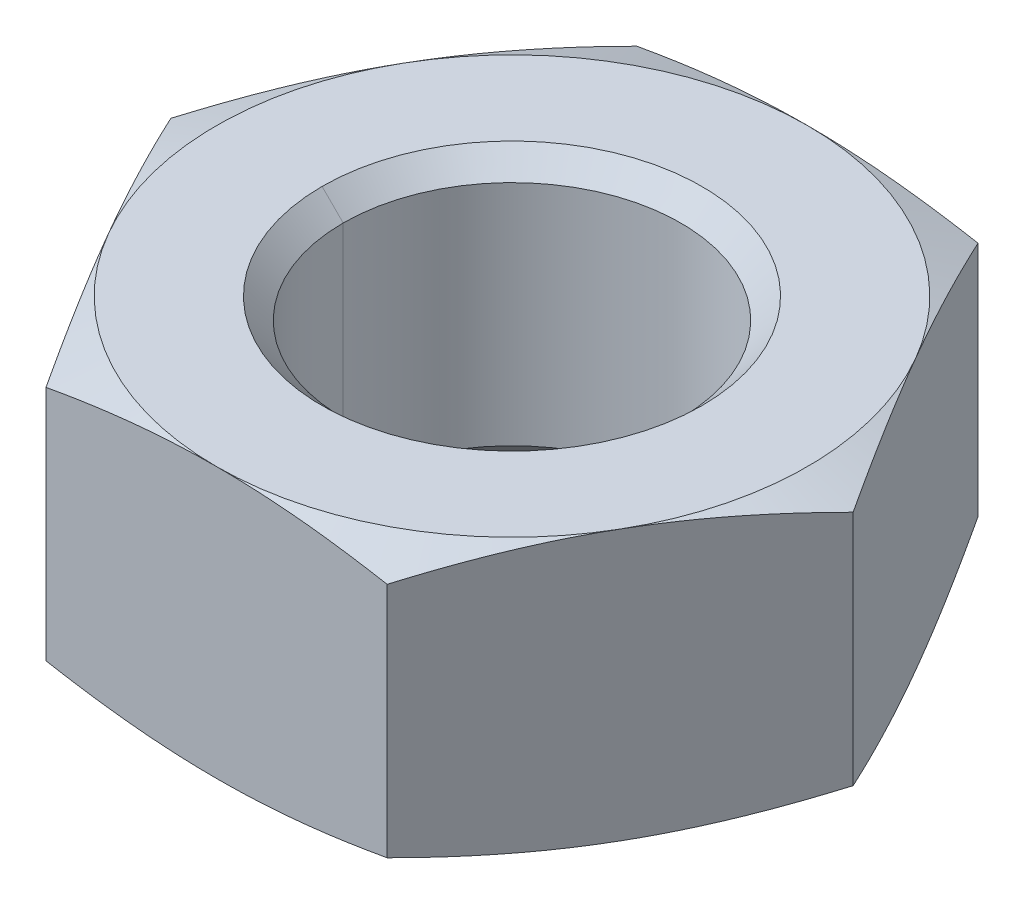
ISO-10303-21;
HEADER;
FILE_DESCRIPTION(('STEP AP214'),'2;1');
FILE_NAME('part.step','',(''),(''),'','','');
FILE_SCHEMA(('AUTOMOTIVE_DESIGN { 1 0 10303 214 1 1 1 1 }'));
ENDSEC;
DATA;
#1=APPLICATION_CONTEXT('core data for automotive mechanical design processes');
#2=APPLICATION_PROTOCOL_DEFINITION('international standard','automotive_design',2000,#1);
#3=PRODUCT_CONTEXT('',#1,'mechanical');
#4=PRODUCT('Part','Part','',(#3));
#5=PRODUCT_RELATED_PRODUCT_CATEGORY('part','',(#4));
#6=PRODUCT_DEFINITION_FORMATION('','',#4);
#7=PRODUCT_DEFINITION_CONTEXT('part definition',#1,'design');
#8=PRODUCT_DEFINITION('design','',#6,#7);
#9=PRODUCT_DEFINITION_SHAPE('','',#8);
#10=(LENGTH_UNIT() NAMED_UNIT(*) SI_UNIT(.MILLI.,.METRE.));
#11=(NAMED_UNIT(*) PLANE_ANGLE_UNIT() SI_UNIT($,.RADIAN.));
#12=(NAMED_UNIT(*) SI_UNIT($,.STERADIAN.) SOLID_ANGLE_UNIT());
#13=UNCERTAINTY_MEASURE_WITH_UNIT(LENGTH_MEASURE(1.E-05),#10,'distance_accuracy_value','');
#14=(GEOMETRIC_REPRESENTATION_CONTEXT(3) GLOBAL_UNCERTAINTY_ASSIGNED_CONTEXT((#13)) GLOBAL_UNIT_ASSIGNED_CONTEXT((#10,
#11,#12)) REPRESENTATION_CONTEXT('',''));
#15=CARTESIAN_POINT('',(0.,0.,0.));
#16=DIRECTION('',(0.,0.,1.));
#17=DIRECTION('',(1.,0.,0.));
#18=AXIS2_PLACEMENT_3D('',#15,#16,#17);
#19=CARTESIAN_POINT('',(0.,0.1250000000798,0.));
#20=DIRECTION('',(0.,-1.,0.));
#21=DIRECTION('',(0.,0.,-1.));
#22=AXIS2_PLACEMENT_3D('',#19,#20,#21);
#23=CONICAL_SURFACE('',#22,2.12499999992,0.7853981633973);
#24=DIRECTION('',(-0.707106781186548,0.707106781186548,1.17576592888708E-09));
#25=VECTOR('',#24,1.);
#26=CARTESIAN_POINT('',(2.249999999907,9.279510493343E-11,-1.247085195041E-09));
#27=LINE('',#26,#25);
#28=CARTESIAN_POINT('',(2.25,0.,0.));
#29=VERTEX_POINT('',#28);
#30=CARTESIAN_POINT('',(2.,0.25,0.));
#31=VERTEX_POINT('',#30);
#32=EDGE_CURVE('E11',#29,#31,#27,.T.);
#33=ORIENTED_EDGE('',*,*,#32,.T.);
#34=CARTESIAN_POINT('',(0.,0.25,0.));
#35=DIRECTION('',(0.,1.,0.));
#36=DIRECTION('',(1.,0.,0.));
#37=AXIS2_PLACEMENT_3D('',#34,#35,#36);
#38=CIRCLE('',#37,2.);
#39=CARTESIAN_POINT('',(-2.,0.25,0.));
#40=VERTEX_POINT('',#39);
#41=EDGE_CURVE('E389',#31,#40,#38,.T.);
#42=ORIENTED_EDGE('',*,*,#41,.T.);
#43=DIRECTION('',(0.707106781186548,0.707106781186548,-1.17576307555008E-09));
#44=VECTOR('',#43,1.);
#45=CARTESIAN_POINT('',(-2.249999999907,9.279510493343E-11,1.247084647792E-09));
#46=LINE('',#45,#44);
#47=CARTESIAN_POINT('',(-2.25,0.,0.));
#48=VERTEX_POINT('',#47);
#49=EDGE_CURVE('E26',#48,#40,#46,.T.);
#50=ORIENTED_EDGE('',*,*,#49,.F.);
#51=CARTESIAN_POINT('',(0.,0.,0.));
#52=DIRECTION('',(0.,1.,0.));
#53=DIRECTION('',(1.,0.,0.));
#54=AXIS2_PLACEMENT_3D('',#51,#52,#53);
#55=CIRCLE('',#54,2.25);
#56=EDGE_CURVE('E371',#29,#48,#55,.T.);
#57=ORIENTED_EDGE('',*,*,#56,.F.);
#58=EDGE_LOOP('',(#33,#42,#50,#57));
#59=FACE_BOUND('',#58,.T.);
#60=ADVANCED_FACE('F16',(#59),#23,.F.);
#61=CARTESIAN_POINT('',(0.,0.1250000000798,0.));
#62=DIRECTION('',(0.,-1.,0.));
#63=DIRECTION('',(0.,0.,-1.));
#64=AXIS2_PLACEMENT_3D('',#61,#62,#63);
#65=CONICAL_SURFACE('',#64,2.12499999992,0.7853981633973);
#66=ORIENTED_EDGE('',*,*,#49,.T.);
#67=CARTESIAN_POINT('',(0.,0.25,0.));
#68=DIRECTION('',(0.,1.,0.));
#69=DIRECTION('',(-1.,0.,0.));
#70=AXIS2_PLACEMENT_3D('',#67,#68,#69);
#71=CIRCLE('',#70,2.);
#72=EDGE_CURVE('E357',#40,#31,#71,.T.);
#73=ORIENTED_EDGE('',*,*,#72,.T.);
#74=ORIENTED_EDGE('',*,*,#32,.F.);
#75=CARTESIAN_POINT('',(0.,0.,0.));
#76=DIRECTION('',(0.,1.,0.));
#77=DIRECTION('',(-1.,0.,0.));
#78=AXIS2_PLACEMENT_3D('',#75,#76,#77);
#79=CIRCLE('',#78,2.25);
#80=EDGE_CURVE('E173',#48,#29,#79,.T.);
#81=ORIENTED_EDGE('',*,*,#80,.F.);
#82=EDGE_LOOP('',(#66,#73,#74,#81));
#83=FACE_BOUND('',#82,.T.);
#84=ADVANCED_FACE('F688',(#83),#65,.F.);
#85=CARTESIAN_POINT('',(0.,3.2,0.));
#86=DIRECTION('',(0.,1.,0.));
#87=DIRECTION('',(1.,0.,0.));
#88=AXIS2_PLACEMENT_3D('',#85,#86,#87);
#89=CYLINDRICAL_SURFACE('',#88,2.);
#90=DIRECTION('',(0.,-1.,0.));
#91=VECTOR('',#90,1.);
#92=CARTESIAN_POINT('',(1.999999999938,2.949999999938,-8.313895128431E-10));
#93=LINE('',#92,#91);
#94=CARTESIAN_POINT('',(2.,2.95,0.));
#95=VERTEX_POINT('',#94);
#96=EDGE_CURVE('E360',#95,#31,#93,.T.);
#97=ORIENTED_EDGE('',*,*,#96,.T.);
#98=ORIENTED_EDGE('',*,*,#72,.F.);
#99=DIRECTION('',(0.,-1.,0.));
#100=VECTOR('',#99,1.);
#101=CARTESIAN_POINT('',(-1.999999999938,2.949999999938,8.313897474171E-10));
#102=LINE('',#101,#100);
#103=CARTESIAN_POINT('',(-2.,2.95,0.));
#104=VERTEX_POINT('',#103);
#105=EDGE_CURVE('E352',#104,#40,#102,.T.);
#106=ORIENTED_EDGE('',*,*,#105,.F.);
#107=CARTESIAN_POINT('',(0.,2.95,0.));
#108=DIRECTION('',(0.,-1.,0.));
#109=DIRECTION('',(1.,0.,0.));
#110=AXIS2_PLACEMENT_3D('',#107,#108,#109);
#111=CIRCLE('',#110,2.);
#112=EDGE_CURVE('E372',#95,#104,#111,.T.);
#113=ORIENTED_EDGE('',*,*,#112,.F.);
#114=EDGE_LOOP('',(#97,#98,#106,#113));
#115=FACE_BOUND('',#114,.T.);
#116=ADVANCED_FACE('F693',(#115),#89,.F.);
#117=CARTESIAN_POINT('',(0.,3.2,0.));
#118=DIRECTION('',(0.,1.,0.));
#119=DIRECTION('',(1.,0.,0.));
#120=AXIS2_PLACEMENT_3D('',#117,#118,#119);
#121=CYLINDRICAL_SURFACE('',#120,2.);
#122=ORIENTED_EDGE('',*,*,#105,.T.);
#123=ORIENTED_EDGE('',*,*,#41,.F.);
#124=ORIENTED_EDGE('',*,*,#96,.F.);
#125=CARTESIAN_POINT('',(0.,2.95,0.));
#126=DIRECTION('',(0.,-1.,0.));
#127=DIRECTION('',(-1.,0.,0.));
#128=AXIS2_PLACEMENT_3D('',#125,#126,#127);
#129=CIRCLE('',#128,2.);
#130=EDGE_CURVE('E345',#104,#95,#129,.T.);
#131=ORIENTED_EDGE('',*,*,#130,.F.);
#132=EDGE_LOOP('',(#122,#123,#124,#131));
#133=FACE_BOUND('',#132,.T.);
#134=ADVANCED_FACE('F713',(#133),#121,.F.);
#135=CARTESIAN_POINT('',(0.,3.07499999992,0.));
#136=DIRECTION('',(0.,1.,0.));
#137=DIRECTION('',(0.,0.,-1.));
#138=AXIS2_PLACEMENT_3D('',#135,#136,#137);
#139=CONICAL_SURFACE('',#138,2.12499999992,0.7853981633973);
#140=DIRECTION('',(0.707106781186548,-0.707106781186548,-1.17576266670908E-09));
#141=VECTOR('',#140,1.);
#142=CARTESIAN_POINT('',(-2.249999999907,3.199999999907,1.247084624713E-09));
#143=LINE('',#142,#141);
#144=CARTESIAN_POINT('',(-2.25,3.2,0.));
#145=VERTEX_POINT('',#144);
#146=EDGE_CURVE('E353',#145,#104,#143,.T.);
#147=ORIENTED_EDGE('',*,*,#146,.T.);
#148=ORIENTED_EDGE('',*,*,#130,.T.);
#149=DIRECTION('',(-0.707106781186548,-0.707106781186548,1.17576334367408E-09));
#150=VECTOR('',#149,1.);
#151=CARTESIAN_POINT('',(2.249999999907,3.199999999907,-1.247084629483E-09));
#152=LINE('',#151,#150);
#153=CARTESIAN_POINT('',(2.25,3.2,0.));
#154=VERTEX_POINT('',#153);
#155=EDGE_CURVE('E376',#154,#95,#152,.T.);
#156=ORIENTED_EDGE('',*,*,#155,.F.);
#157=CARTESIAN_POINT('',(0.,3.2,0.));
#158=DIRECTION('',(0.,-1.,0.));
#159=DIRECTION('',(-1.,0.,0.));
#160=AXIS2_PLACEMENT_3D('',#157,#158,#159);
#161=CIRCLE('',#160,2.25);
#162=EDGE_CURVE('E242',#145,#154,#161,.T.);
#163=ORIENTED_EDGE('',*,*,#162,.F.);
#164=EDGE_LOOP('',(#147,#148,#156,#163));
#165=FACE_BOUND('',#164,.T.);
#166=ADVANCED_FACE('F708',(#165),#139,.F.);
#167=CARTESIAN_POINT('',(0.,3.07499999992,0.));
#168=DIRECTION('',(0.,1.,0.));
#169=DIRECTION('',(0.,0.,-1.));
#170=AXIS2_PLACEMENT_3D('',#167,#168,#169);
#171=CONICAL_SURFACE('',#170,2.12499999992,0.7853981633973);
#172=ORIENTED_EDGE('',*,*,#155,.T.);
#173=ORIENTED_EDGE('',*,*,#112,.T.);
#174=ORIENTED_EDGE('',*,*,#146,.F.);
#175=CARTESIAN_POINT('',(0.,3.2,0.));
#176=DIRECTION('',(0.,-1.,0.));
#177=DIRECTION('',(1.,0.,0.));
#178=AXIS2_PLACEMENT_3D('',#175,#176,#177);
#179=CIRCLE('',#178,2.25);
#180=EDGE_CURVE('E20',#154,#145,#179,.T.);
#181=ORIENTED_EDGE('',*,*,#180,.F.);
#182=EDGE_LOOP('',(#172,#173,#174,#181));
#183=FACE_BOUND('',#182,.T.);
#184=ADVANCED_FACE('F18',(#183),#171,.F.);
#185=CARTESIAN_POINT('',(2.020725942164,0.,-3.5));
#186=DIRECTION('',(0.,0.,-1.));
#187=DIRECTION('',(0.,-1.,0.));
#188=AXIS2_PLACEMENT_3D('',#185,#186,#187);
#189=PLANE('',#188);
#190=CARTESIAN_POINT('',(0.,3.2,-3.5));
#191=CARTESIAN_POINT('',(0.1339194928935,3.2,-3.5));
#192=CARTESIAN_POINT('',(0.4014780252801,3.194384619764,-3.5));
#193=CARTESIAN_POINT('',(0.8017778390431,3.169575725015,-3.5));
#194=CARTESIAN_POINT('',(1.201630119939,3.12936102724,-3.5));
#195=CARTESIAN_POINT('',(1.604047431304,3.074757420419,-3.5));
#196=CARTESIAN_POINT('',(1.880778102078,3.028396054888,-3.5));
#197=CARTESIAN_POINT('',(2.020725942164,3.002927630817,-3.5));
#198=(BOUNDED_CURVE() B_SPLINE_CURVE(3,(#190,#191,#192,#193,#194,#195,#196,#197),.UNSPECIFIED.,
.F.,.F.) B_SPLINE_CURVE_WITH_KNOTS((4,1,1,1,1,4),(0.,0.2,0.4,0.6,0.8,1.),
.UNSPECIFIED.) CURVE() GEOMETRIC_REPRESENTATION_ITEM() RATIONAL_B_SPLINE_CURVE((1.,1.,1.,1.,1.,
1.,1.,1.)) REPRESENTATION_ITEM(''));
#199=CARTESIAN_POINT('',(0.,3.2,-3.5));
#200=VERTEX_POINT('',#199);
#201=CARTESIAN_POINT('',(2.020725942164,3.002927630817,-3.5));
#202=VERTEX_POINT('',#201);
#203=EDGE_CURVE('E208',#200,#202,#198,.T.);
#204=ORIENTED_EDGE('',*,*,#203,.T.);
#205=DIRECTION('',(0.,1.,0.));
#206=VECTOR('',#205,1.);
#207=CARTESIAN_POINT('',(2.020725942164,0.1970723691825,-3.5));
#208=LINE('',#207,#206);
#209=CARTESIAN_POINT('',(2.020725942164,0.1970723691825,-3.5));
#210=VERTEX_POINT('',#209);
#211=EDGE_CURVE('E167',#210,#202,#208,.T.);
#212=ORIENTED_EDGE('',*,*,#211,.F.);
#213=CARTESIAN_POINT('',(0.,0.,-3.5));
#214=CARTESIAN_POINT('',(0.1339194928935,0.,-3.5));
#215=CARTESIAN_POINT('',(0.4014780252801,0.00561538023578,-3.5));
#216=CARTESIAN_POINT('',(0.8017778390431,0.03042427498523,-3.5));
#217=CARTESIAN_POINT('',(1.201630119939,0.0706389727602,-3.5));
#218=CARTESIAN_POINT('',(1.604047431304,0.1252425795814,-3.5));
#219=CARTESIAN_POINT('',(1.880778102078,0.171603945112,-3.5));
#220=CARTESIAN_POINT('',(2.020725942164,0.1970723691825,-3.5));
#221=(BOUNDED_CURVE() B_SPLINE_CURVE(3,(#213,#214,#215,#216,#217,#218,#219,#220),.UNSPECIFIED.,
.F.,.F.) B_SPLINE_CURVE_WITH_KNOTS((4,1,1,1,1,4),(0.,0.2,0.4,0.6,0.8,1.),
.UNSPECIFIED.) CURVE() GEOMETRIC_REPRESENTATION_ITEM() RATIONAL_B_SPLINE_CURVE((1.,1.,1.,1.,1.,
1.,1.,1.)) REPRESENTATION_ITEM(''));
#222=CARTESIAN_POINT('',(0.,0.,-3.5));
#223=VERTEX_POINT('',#222);
#224=EDGE_CURVE('E163',#223,#210,#221,.T.);
#225=ORIENTED_EDGE('',*,*,#224,.F.);
#226=CARTESIAN_POINT('',(-2.020725942164,0.1970723691825,-3.5));
#227=CARTESIAN_POINT('',(-1.880789645323,0.1716060458108,-3.5));
#228=CARTESIAN_POINT('',(-1.604066452559,0.125244479407,-3.5));
#229=CARTESIAN_POINT('',(-1.201512024155,0.07062397958714,-3.5));
#230=CARTESIAN_POINT('',(-0.8016732597447,0.0304163872762,-3.5));
#231=CARTESIAN_POINT('',(-0.4014197833047,0.005613602052182,-3.5));
#232=CARTESIAN_POINT('',(-0.1338981911009,0.,-3.5));
#233=CARTESIAN_POINT('',(0.,0.,-3.5));
#234=(BOUNDED_CURVE() B_SPLINE_CURVE(3,(#226,#227,#228,#229,#230,#231,#232,#233),.UNSPECIFIED.,
.F.,.F.) B_SPLINE_CURVE_WITH_KNOTS((4,1,1,1,1,4),(0.,0.2,0.4,0.6,0.8,1.),
.UNSPECIFIED.) CURVE() GEOMETRIC_REPRESENTATION_ITEM() RATIONAL_B_SPLINE_CURVE((1.,1.,1.,1.,1.,
1.,1.,1.)) REPRESENTATION_ITEM(''));
#235=CARTESIAN_POINT('',(-2.020725942164,0.1970723691825,-3.5));
#236=VERTEX_POINT('',#235);
#237=EDGE_CURVE('E152',#236,#223,#234,.T.);
#238=ORIENTED_EDGE('',*,*,#237,.F.);
#239=DIRECTION('',(0.,1.,0.));
#240=VECTOR('',#239,1.);
#241=CARTESIAN_POINT('',(-2.020725942164,0.1970723691825,-3.5));
#242=LINE('',#241,#240);
#243=CARTESIAN_POINT('',(-2.020725942164,3.002927630817,-3.5));
#244=VERTEX_POINT('',#243);
#245=EDGE_CURVE('E367',#236,#244,#242,.T.);
#246=ORIENTED_EDGE('',*,*,#245,.T.);
#247=CARTESIAN_POINT('',(-2.020725942164,3.002927630817,-3.5));
#248=CARTESIAN_POINT('',(-1.880789645323,3.028393954189,-3.5));
#249=CARTESIAN_POINT('',(-1.604066452559,3.074755520593,-3.5));
#250=CARTESIAN_POINT('',(-1.201512024155,3.129376020413,-3.5));
#251=CARTESIAN_POINT('',(-0.8016732597447,3.169583612724,-3.5));
#252=CARTESIAN_POINT('',(-0.4014197833047,3.194386397948,-3.5));
#253=CARTESIAN_POINT('',(-0.1338981911009,3.2,-3.5));
#254=CARTESIAN_POINT('',(0.,3.2,-3.5));
#255=(BOUNDED_CURVE() B_SPLINE_CURVE(3,(#247,#248,#249,#250,#251,#252,#253,#254),.UNSPECIFIED.,
.F.,.F.) B_SPLINE_CURVE_WITH_KNOTS((4,1,1,1,1,4),(0.,0.2,0.4,0.6,0.8,1.),
.UNSPECIFIED.) CURVE() GEOMETRIC_REPRESENTATION_ITEM() RATIONAL_B_SPLINE_CURVE((1.,1.,1.,1.,1.,
1.,1.,1.)) REPRESENTATION_ITEM(''));
#256=EDGE_CURVE('E273',#244,#200,#255,.T.);
#257=ORIENTED_EDGE('',*,*,#256,.T.);
#258=EDGE_LOOP('',(#204,#212,#225,#238,#246,#257));
#259=FACE_BOUND('',#258,.T.);
#260=ADVANCED_FACE('F165',(#259),#189,.T.);
#261=CARTESIAN_POINT('',(-2.020725942164,0.,-3.5));
#262=DIRECTION('',(-0.866025403784429,0.,-0.500000000000017));
#263=DIRECTION('',(-0.500000000000017,0.,0.866025403784429));
#264=AXIS2_PLACEMENT_3D('',#261,#262,#263);
#265=PLANE('',#264);
#266=CARTESIAN_POINT('',(-3.031088913246,3.2,-1.75));
#267=CARTESIAN_POINT('',(-2.964129166799,3.2,-1.865977682908));
#268=CARTESIAN_POINT('',(-2.830349900605,3.194384619764,-2.097690168954));
#269=CARTESIAN_POINT('',(-2.630199993724,3.169575725015,-2.444359976803));
#270=CARTESIAN_POINT('',(-2.430273853276,3.12936102724,-2.79064220982));
#271=CARTESIAN_POINT('',(-2.229065197593,3.074757420419,-3.139145824385));
#272=CARTESIAN_POINT('',(-2.090699862207,3.028396054888,-3.378801615281));
#273=CARTESIAN_POINT('',(-2.020725942164,3.002927630817,-3.5));
#274=(BOUNDED_CURVE() B_SPLINE_CURVE(3,(#266,#267,#268,#269,#270,#271,#272,#273),.UNSPECIFIED.,
.F.,.F.) B_SPLINE_CURVE_WITH_KNOTS((4,1,1,1,1,4),(0.,0.2,0.4,0.6,0.8,1.),
.UNSPECIFIED.) CURVE() GEOMETRIC_REPRESENTATION_ITEM() RATIONAL_B_SPLINE_CURVE((1.,1.,1.,1.,1.,
1.,1.,1.)) REPRESENTATION_ITEM(''));
#275=CARTESIAN_POINT('',(-3.031088913246,3.2,-1.75));
#276=VERTEX_POINT('',#275);
#277=EDGE_CURVE('E263',#276,#244,#274,.T.);
#278=ORIENTED_EDGE('',*,*,#277,.T.);
#279=ORIENTED_EDGE('',*,*,#245,.F.);
#280=CARTESIAN_POINT('',(-3.031088913246,0.,-1.75));
#281=CARTESIAN_POINT('',(-2.964129166799,0.,-1.865977682908));
#282=CARTESIAN_POINT('',(-2.830349900605,0.005615380235781,-2.097690168954));
#283=CARTESIAN_POINT('',(-2.630199993724,0.03042427498523,-2.444359976803));
#284=CARTESIAN_POINT('',(-2.430273853276,0.0706389727602,-2.79064220982));
#285=CARTESIAN_POINT('',(-2.229065197593,0.1252425795814,-3.139145824385));
#286=CARTESIAN_POINT('',(-2.090699862207,0.171603945112,-3.378801615281));
#287=CARTESIAN_POINT('',(-2.020725942164,0.1970723691825,-3.5));
#288=(BOUNDED_CURVE() B_SPLINE_CURVE(3,(#280,#281,#282,#283,#284,#285,#286,#287),.UNSPECIFIED.,
.F.,.F.) B_SPLINE_CURVE_WITH_KNOTS((4,1,1,1,1,4),(0.,0.2,0.4,0.6,0.8,1.),
.UNSPECIFIED.) CURVE() GEOMETRIC_REPRESENTATION_ITEM() RATIONAL_B_SPLINE_CURVE((1.,1.,1.,1.,1.,
1.,1.,1.)) REPRESENTATION_ITEM(''));
#289=CARTESIAN_POINT('',(-3.031088913246,0.,-1.75));
#290=VERTEX_POINT('',#289);
#291=EDGE_CURVE('E157',#290,#236,#288,.T.);
#292=ORIENTED_EDGE('',*,*,#291,.F.);
#293=CARTESIAN_POINT('',(-4.041451884327,0.1970723691825,0.));
#294=CARTESIAN_POINT('',(-3.971483735907,0.1716060458108,-0.1211883879753));
#295=CARTESIAN_POINT('',(-3.833122139525,0.125244479407,-0.3608377027251));
#296=CARTESIAN_POINT('',(-3.631844925323,0.07062397958714,-0.7094600641289));
#297=CARTESIAN_POINT('',(-3.431925543118,0.0304163872762,-1.055730591526));
#298=CARTESIAN_POINT('',(-3.231798804898,0.005613602052183,-1.402360270076));
#299=CARTESIAN_POINT('',(-3.098038008796,0.,-1.634040764986));
#300=CARTESIAN_POINT('',(-3.031088913246,0.,-1.75));
#301=(BOUNDED_CURVE() B_SPLINE_CURVE(3,(#293,#294,#295,#296,#297,#298,#299,#300),.UNSPECIFIED.,
.F.,.F.) B_SPLINE_CURVE_WITH_KNOTS((4,1,1,1,1,4),(0.,0.2,0.4,0.6,0.8,1.),
.UNSPECIFIED.) CURVE() GEOMETRIC_REPRESENTATION_ITEM() RATIONAL_B_SPLINE_CURVE((1.,1.,1.,1.,1.,
1.,1.,1.)) REPRESENTATION_ITEM(''));
#302=CARTESIAN_POINT('',(-4.041451884327,0.1970723691825,0.));
#303=VERTEX_POINT('',#302);
#304=EDGE_CURVE('E143',#303,#290,#301,.T.);
#305=ORIENTED_EDGE('',*,*,#304,.F.);
#306=DIRECTION('',(0.,1.,0.));
#307=VECTOR('',#306,1.);
#308=CARTESIAN_POINT('',(-4.041451884327,0.1970723691825,0.));
#309=LINE('',#308,#307);
#310=CARTESIAN_POINT('',(-4.041451884327,3.002927630817,0.));
#311=VERTEX_POINT('',#310);
#312=EDGE_CURVE('E363',#303,#311,#309,.T.);
#313=ORIENTED_EDGE('',*,*,#312,.T.);
#314=CARTESIAN_POINT('',(-4.041451884327,3.002927630817,0.));
#315=CARTESIAN_POINT('',(-3.971483735907,3.028393954189,-0.1211883879753));
#316=CARTESIAN_POINT('',(-3.833122139525,3.074755520593,-0.3608377027251));
#317=CARTESIAN_POINT('',(-3.631844925323,3.129376020413,-0.7094600641289));
#318=CARTESIAN_POINT('',(-3.431925543118,3.169583612724,-1.055730591526));
#319=CARTESIAN_POINT('',(-3.231798804898,3.194386397948,-1.402360270076));
#320=CARTESIAN_POINT('',(-3.098038008796,3.2,-1.634040764986));
#321=CARTESIAN_POINT('',(-3.031088913246,3.2,-1.75));
#322=(BOUNDED_CURVE() B_SPLINE_CURVE(3,(#314,#315,#316,#317,#318,#319,#320,#321),.UNSPECIFIED.,
.F.,.F.) B_SPLINE_CURVE_WITH_KNOTS((4,1,1,1,1,4),(0.,0.2,0.4,0.6,0.8,1.),
.UNSPECIFIED.) CURVE() GEOMETRIC_REPRESENTATION_ITEM() RATIONAL_B_SPLINE_CURVE((1.,1.,1.,1.,1.,
1.,1.,1.)) REPRESENTATION_ITEM(''));
#323=EDGE_CURVE('E225',#311,#276,#322,.T.);
#324=ORIENTED_EDGE('',*,*,#323,.T.);
#325=EDGE_LOOP('',(#278,#279,#292,#305,#313,#324));
#326=FACE_BOUND('',#325,.T.);
#327=ADVANCED_FACE('F651',(#326),#265,.T.);
#328=CARTESIAN_POINT('',(-4.041451884327,0.,0.));
#329=DIRECTION('',(-0.866025403784429,0.,0.500000000000017));
#330=DIRECTION('',(0.,1.,0.));
#331=AXIS2_PLACEMENT_3D('',#328,#329,#330);
#332=PLANE('',#331);
#333=CARTESIAN_POINT('',(-3.031088913246,3.2,1.75));
#334=CARTESIAN_POINT('',(-3.098048659692,3.2,1.634022317092));
#335=CARTESIAN_POINT('',(-3.231827925886,3.194384619764,1.402309831046));
#336=CARTESIAN_POINT('',(-3.431977832767,3.169575725015,1.055640023197));
#337=CARTESIAN_POINT('',(-3.631903973215,3.12936102724,0.7093577901802));
#338=CARTESIAN_POINT('',(-3.833112628898,3.074757420419,0.3608541756155));
#339=CARTESIAN_POINT('',(-3.971477964284,3.028396054888,0.1211983847191));
#340=CARTESIAN_POINT('',(-4.041451884327,3.002927630817,0.));
#341=(BOUNDED_CURVE() B_SPLINE_CURVE(3,(#333,#334,#335,#336,#337,#338,#339,#340),.UNSPECIFIED.,
.F.,.F.) B_SPLINE_CURVE_WITH_KNOTS((4,1,1,1,1,4),(0.,0.2,0.4,0.6,0.8,1.),
.UNSPECIFIED.) CURVE() GEOMETRIC_REPRESENTATION_ITEM() RATIONAL_B_SPLINE_CURVE((1.,1.,1.,1.,1.,
1.,1.,1.)) REPRESENTATION_ITEM(''));
#342=CARTESIAN_POINT('',(-3.031088913246,3.2,1.75));
#343=VERTEX_POINT('',#342);
#344=EDGE_CURVE('E215',#343,#311,#341,.T.);
#345=ORIENTED_EDGE('',*,*,#344,.T.);
#346=ORIENTED_EDGE('',*,*,#312,.F.);
#347=CARTESIAN_POINT('',(-3.031088913246,0.,1.75));
#348=CARTESIAN_POINT('',(-3.098048659692,0.,1.634022317092));
#349=CARTESIAN_POINT('',(-3.231827925886,0.005615380235781,1.402309831046));
#350=CARTESIAN_POINT('',(-3.431977832767,0.03042427498523,1.055640023197));
#351=CARTESIAN_POINT('',(-3.631903973215,0.0706389727602,0.7093577901802));
#352=CARTESIAN_POINT('',(-3.833112628898,0.1252425795814,0.3608541756155));
#353=CARTESIAN_POINT('',(-3.971477964284,0.171603945112,0.1211983847191));
#354=CARTESIAN_POINT('',(-4.041451884327,0.1970723691825,0.));
#355=(BOUNDED_CURVE() B_SPLINE_CURVE(3,(#347,#348,#349,#350,#351,#352,#353,#354),.UNSPECIFIED.,
.F.,.F.) B_SPLINE_CURVE_WITH_KNOTS((4,1,1,1,1,4),(0.,0.2,0.4,0.6,0.8,1.),
.UNSPECIFIED.) CURVE() GEOMETRIC_REPRESENTATION_ITEM() RATIONAL_B_SPLINE_CURVE((1.,1.,1.,1.,1.,
1.,1.,1.)) REPRESENTATION_ITEM(''));
#356=CARTESIAN_POINT('',(-3.031088913246,0.,1.75));
#357=VERTEX_POINT('',#356);
#358=EDGE_CURVE('E336',#357,#303,#355,.T.);
#359=ORIENTED_EDGE('',*,*,#358,.F.);
#360=CARTESIAN_POINT('',(-2.020725942164,0.1970723691825,3.5));
#361=CARTESIAN_POINT('',(-2.090694090584,0.1716060458108,3.378811612025));
#362=CARTESIAN_POINT('',(-2.229055686966,0.125244479407,3.139162297275));
#363=CARTESIAN_POINT('',(-2.430332901168,0.07062397958714,2.790539935871));
#364=CARTESIAN_POINT('',(-2.630252283373,0.0304163872762,2.444269408474));
#365=CARTESIAN_POINT('',(-2.830379021593,0.005613602052183,2.097639729924));
#366=CARTESIAN_POINT('',(-2.964139817695,0.,1.865959235014));
#367=CARTESIAN_POINT('',(-3.031088913246,0.,1.75));
#368=(BOUNDED_CURVE() B_SPLINE_CURVE(3,(#360,#361,#362,#363,#364,#365,#366,#367),.UNSPECIFIED.,
.F.,.F.) B_SPLINE_CURVE_WITH_KNOTS((4,1,1,1,1,4),(0.,0.2,0.4,0.6,0.8,1.),
.UNSPECIFIED.) CURVE() GEOMETRIC_REPRESENTATION_ITEM() RATIONAL_B_SPLINE_CURVE((1.,1.,1.,1.,1.,
1.,1.,1.)) REPRESENTATION_ITEM(''));
#369=CARTESIAN_POINT('',(-2.020725942164,0.1970723691825,3.5));
#370=VERTEX_POINT('',#369);
#371=EDGE_CURVE('E344',#370,#357,#368,.T.);
#372=ORIENTED_EDGE('',*,*,#371,.F.);
#373=DIRECTION('',(0.,1.,0.));
#374=VECTOR('',#373,1.);
#375=CARTESIAN_POINT('',(-2.020725942164,0.1970723691825,3.5));
#376=LINE('',#375,#374);
#377=CARTESIAN_POINT('',(-2.020725942164,3.002927630817,3.5));
#378=VERTEX_POINT('',#377);
#379=EDGE_CURVE('E282',#370,#378,#376,.T.);
#380=ORIENTED_EDGE('',*,*,#379,.T.);
#381=CARTESIAN_POINT('',(-2.020725942164,3.002927630817,3.5));
#382=CARTESIAN_POINT('',(-2.090694090584,3.028393954189,3.378811612025));
#383=CARTESIAN_POINT('',(-2.229055686966,3.074755520593,3.139162297275));
#384=CARTESIAN_POINT('',(-2.430332901168,3.129376020413,2.790539935871));
#385=CARTESIAN_POINT('',(-2.630252283373,3.169583612724,2.444269408474));
#386=CARTESIAN_POINT('',(-2.830379021593,3.194386397948,2.097639729924));
#387=CARTESIAN_POINT('',(-2.964139817695,3.2,1.865959235014));
#388=CARTESIAN_POINT('',(-3.031088913246,3.2,1.75));
#389=(BOUNDED_CURVE() B_SPLINE_CURVE(3,(#381,#382,#383,#384,#385,#386,#387,#388),.UNSPECIFIED.,
.F.,.F.) B_SPLINE_CURVE_WITH_KNOTS((4,1,1,1,1,4),(0.,0.2,0.4,0.6,0.8,1.),
.UNSPECIFIED.) CURVE() GEOMETRIC_REPRESENTATION_ITEM() RATIONAL_B_SPLINE_CURVE((1.,1.,1.,1.,1.,
1.,1.,1.)) REPRESENTATION_ITEM(''));
#390=EDGE_CURVE('E206',#378,#343,#389,.T.);
#391=ORIENTED_EDGE('',*,*,#390,.T.);
#392=EDGE_LOOP('',(#345,#346,#359,#372,#380,#391));
#393=FACE_BOUND('',#392,.T.);
#394=ADVANCED_FACE('F656',(#393),#332,.T.);
#395=CARTESIAN_POINT('',(-2.020725942164,0.,3.5));
#396=DIRECTION('',(0.,0.,1.));
#397=DIRECTION('',(1.,0.,0.));
#398=AXIS2_PLACEMENT_3D('',#395,#396,#397);
#399=PLANE('',#398);
#400=CARTESIAN_POINT('',(0.,3.2,3.5));
#401=CARTESIAN_POINT('',(-0.1339194928935,3.2,3.5));
#402=CARTESIAN_POINT('',(-0.4014780252801,3.194384619764,3.5));
#403=CARTESIAN_POINT('',(-0.8017778390431,3.169575725015,3.5));
#404=CARTESIAN_POINT('',(-1.201630119939,3.12936102724,3.5));
#405=CARTESIAN_POINT('',(-1.604047431304,3.074757420419,3.5));
#406=CARTESIAN_POINT('',(-1.880778102078,3.028396054888,3.5));
#407=CARTESIAN_POINT('',(-2.020725942164,3.002927630817,3.5));
#408=(BOUNDED_CURVE() B_SPLINE_CURVE(3,(#400,#401,#402,#403,#404,#405,#406,#407),.UNSPECIFIED.,
.F.,.F.) B_SPLINE_CURVE_WITH_KNOTS((4,1,1,1,1,4),(0.,0.2,0.4,0.6,0.8,1.),
.UNSPECIFIED.) CURVE() GEOMETRIC_REPRESENTATION_ITEM() RATIONAL_B_SPLINE_CURVE((1.,1.,1.,1.,1.,
1.,1.,1.)) REPRESENTATION_ITEM(''));
#409=CARTESIAN_POINT('',(0.,3.2,3.5));
#410=VERTEX_POINT('',#409);
#411=EDGE_CURVE('E235',#410,#378,#408,.T.);
#412=ORIENTED_EDGE('',*,*,#411,.T.);
#413=ORIENTED_EDGE('',*,*,#379,.F.);
#414=CARTESIAN_POINT('',(0.,0.,3.5));
#415=CARTESIAN_POINT('',(-0.1339194928935,0.,3.5));
#416=CARTESIAN_POINT('',(-0.4014780252801,0.00561538023578,3.5));
#417=CARTESIAN_POINT('',(-0.8017778390431,0.03042427498523,3.5));
#418=CARTESIAN_POINT('',(-1.201630119939,0.0706389727602,3.5));
#419=CARTESIAN_POINT('',(-1.604047431304,0.1252425795814,3.5));
#420=CARTESIAN_POINT('',(-1.880778102078,0.171603945112,3.5));
#421=CARTESIAN_POINT('',(-2.020725942164,0.1970723691825,3.5));
#422=(BOUNDED_CURVE() B_SPLINE_CURVE(3,(#414,#415,#416,#417,#418,#419,#420,#421),.UNSPECIFIED.,
.F.,.F.) B_SPLINE_CURVE_WITH_KNOTS((4,1,1,1,1,4),(0.,0.2,0.4,0.6,0.8,1.),
.UNSPECIFIED.) CURVE() GEOMETRIC_REPRESENTATION_ITEM() RATIONAL_B_SPLINE_CURVE((1.,1.,1.,1.,1.,
1.,1.,1.)) REPRESENTATION_ITEM(''));
#423=CARTESIAN_POINT('',(0.,0.,3.5));
#424=VERTEX_POINT('',#423);
#425=EDGE_CURVE('E320',#424,#370,#422,.T.);
#426=ORIENTED_EDGE('',*,*,#425,.F.);
#427=CARTESIAN_POINT('',(2.020725942164,0.1970723691825,3.5));
#428=CARTESIAN_POINT('',(1.880789645323,0.1716060458108,3.5));
#429=CARTESIAN_POINT('',(1.604066452559,0.125244479407,3.5));
#430=CARTESIAN_POINT('',(1.201512024155,0.07062397958714,3.5));
#431=CARTESIAN_POINT('',(0.8016732597447,0.0304163872762,3.5));
#432=CARTESIAN_POINT('',(0.4014197833047,0.005613602052182,3.5));
#433=CARTESIAN_POINT('',(0.1338981911009,0.,3.5));
#434=CARTESIAN_POINT('',(0.,0.,3.5));
#435=(BOUNDED_CURVE() B_SPLINE_CURVE(3,(#427,#428,#429,#430,#431,#432,#433,#434),.UNSPECIFIED.,
.F.,.F.) B_SPLINE_CURVE_WITH_KNOTS((4,1,1,1,1,4),(0.,0.2,0.4,0.6,0.8,1.),
.UNSPECIFIED.) CURVE() GEOMETRIC_REPRESENTATION_ITEM() RATIONAL_B_SPLINE_CURVE((1.,1.,1.,1.,1.,
1.,1.,1.)) REPRESENTATION_ITEM(''));
#436=CARTESIAN_POINT('',(2.020725942164,0.1970723691825,3.5));
#437=VERTEX_POINT('',#436);
#438=EDGE_CURVE('E314',#437,#424,#435,.T.);
#439=ORIENTED_EDGE('',*,*,#438,.F.);
#440=DIRECTION('',(0.,1.,0.));
#441=VECTOR('',#440,1.);
#442=CARTESIAN_POINT('',(2.020725942164,0.1970723691825,3.5));
#443=LINE('',#442,#441);
#444=CARTESIAN_POINT('',(2.020725942164,3.002927630817,3.5));
#445=VERTEX_POINT('',#444);
#446=EDGE_CURVE('E283',#437,#445,#443,.T.);
#447=ORIENTED_EDGE('',*,*,#446,.T.);
#448=CARTESIAN_POINT('',(2.020725942164,3.002927630817,3.5));
#449=CARTESIAN_POINT('',(1.880789645323,3.028393954189,3.5));
#450=CARTESIAN_POINT('',(1.604066452559,3.074755520593,3.5));
#451=CARTESIAN_POINT('',(1.201512024155,3.129376020413,3.5));
#452=CARTESIAN_POINT('',(0.8016732597447,3.169583612724,3.5));
#453=CARTESIAN_POINT('',(0.4014197833047,3.194386397948,3.5));
#454=CARTESIAN_POINT('',(0.1338981911009,3.2,3.5));
#455=CARTESIAN_POINT('',(0.,3.2,3.5));
#456=(BOUNDED_CURVE() B_SPLINE_CURVE(3,(#448,#449,#450,#451,#452,#453,#454,#455),.UNSPECIFIED.,
.F.,.F.) B_SPLINE_CURVE_WITH_KNOTS((4,1,1,1,1,4),(0.,0.2,0.4,0.6,0.8,1.),
.UNSPECIFIED.) CURVE() GEOMETRIC_REPRESENTATION_ITEM() RATIONAL_B_SPLINE_CURVE((1.,1.,1.,1.,1.,
1.,1.,1.)) REPRESENTATION_ITEM(''));
#457=EDGE_CURVE('E254',#445,#410,#456,.T.);
#458=ORIENTED_EDGE('',*,*,#457,.T.);
#459=EDGE_LOOP('',(#412,#413,#426,#439,#447,#458));
#460=FACE_BOUND('',#459,.T.);
#461=ADVANCED_FACE('F476',(#460),#399,.T.);
#462=CARTESIAN_POINT('',(0.,0.09853618459126,0.));
#463=DIRECTION('',(0.,1.,0.));
#464=DIRECTION('',(1.,0.,0.));
#465=AXIS2_PLACEMENT_3D('',#462,#463,#464);
#466=CONICAL_SURFACE('',#465,3.770725942164,1.2217304763958);
#467=CARTESIAN_POINT('',(3.031088913246,0.,-1.75));
#468=CARTESIAN_POINT('',(3.098048659692,0.,-1.634022317092));
#469=CARTESIAN_POINT('',(3.231827925886,0.00561538023578,-1.402309831046));
#470=CARTESIAN_POINT('',(3.431977832767,0.03042427498523,-1.055640023197));
#471=CARTESIAN_POINT('',(3.631903973215,0.0706389727602,-0.7093577901802));
#472=CARTESIAN_POINT('',(3.833112628898,0.1252425795814,-0.3608541756155));
#473=CARTESIAN_POINT('',(3.971477964284,0.171603945112,-0.1211983847191));
#474=CARTESIAN_POINT('',(4.041451884327,0.1970723691825,0.));
#475=(BOUNDED_CURVE() B_SPLINE_CURVE(3,(#467,#468,#469,#470,#471,#472,#473,#474),.UNSPECIFIED.,
.F.,.F.) B_SPLINE_CURVE_WITH_KNOTS((4,1,1,1,1,4),(0.,0.2,0.4,0.6,0.8,1.),
.UNSPECIFIED.) CURVE() GEOMETRIC_REPRESENTATION_ITEM() RATIONAL_B_SPLINE_CURVE((1.,1.,1.,1.,1.,
1.,1.,1.)) REPRESENTATION_ITEM(''));
#476=CARTESIAN_POINT('',(3.031088913246,0.,-1.75));
#477=VERTEX_POINT('',#476);
#478=CARTESIAN_POINT('',(4.041451884327,0.1970723691825,0.));
#479=VERTEX_POINT('',#478);
#480=EDGE_CURVE('E233',#477,#479,#475,.T.);
#481=ORIENTED_EDGE('',*,*,#480,.T.);
#482=CARTESIAN_POINT('',(4.041451884327,0.1970723691825,0.));
#483=CARTESIAN_POINT('',(3.971483735907,0.1716060458108,0.1211883879753));
#484=CARTESIAN_POINT('',(3.833122139525,0.125244479407,0.3608377027251));
#485=CARTESIAN_POINT('',(3.631844925323,0.07062397958714,0.7094600641289));
#486=CARTESIAN_POINT('',(3.431925543118,0.0304163872762,1.055730591526));
#487=CARTESIAN_POINT('',(3.231798804898,0.005613602052181,1.402360270076));
#488=CARTESIAN_POINT('',(3.098038008796,0.,1.634040764986));
#489=CARTESIAN_POINT('',(3.031088913246,0.,1.75));
#490=(BOUNDED_CURVE() B_SPLINE_CURVE(3,(#482,#483,#484,#485,#486,#487,#488,#489),.UNSPECIFIED.,
.F.,.F.) B_SPLINE_CURVE_WITH_KNOTS((4,1,1,1,1,4),(0.,0.2,0.4,0.6,0.8,1.),
.UNSPECIFIED.) CURVE() GEOMETRIC_REPRESENTATION_ITEM() RATIONAL_B_SPLINE_CURVE((1.,1.,1.,1.,1.,
1.,1.,1.)) REPRESENTATION_ITEM(''));
#491=CARTESIAN_POINT('',(3.031088913246,0.,1.75));
#492=VERTEX_POINT('',#491);
#493=EDGE_CURVE('E274',#479,#492,#490,.T.);
#494=ORIENTED_EDGE('',*,*,#493,.T.);
#495=CARTESIAN_POINT('',(0.,0.,0.));
#496=DIRECTION('',(0.,-1.,0.));
#497=DIRECTION('',(0.866025403784429,0.,-0.500000000000017));
#498=AXIS2_PLACEMENT_3D('',#495,#496,#497);
#499=CIRCLE('',#498,3.5);
#500=EDGE_CURVE('E182',#477,#492,#499,.T.);
#501=ORIENTED_EDGE('',*,*,#500,.F.);
#502=EDGE_LOOP('',(#481,#494,#501));
#503=FACE_BOUND('',#502,.T.);
#504=ADVANCED_FACE('F676',(#503),#466,.T.);
#505=CARTESIAN_POINT('',(2.020725942164,0.,3.5));
#506=DIRECTION('',(0.866025403784429,0.,0.500000000000017));
#507=DIRECTION('',(0.,-1.,0.));
#508=AXIS2_PLACEMENT_3D('',#505,#506,#507);
#509=PLANE('',#508);
#510=CARTESIAN_POINT('',(3.031088913246,3.2,1.75));
#511=CARTESIAN_POINT('',(2.964129166799,3.2,1.865977682908));
#512=CARTESIAN_POINT('',(2.830349900605,3.194384619764,2.097690168954));
#513=CARTESIAN_POINT('',(2.630199993724,3.169575725015,2.444359976803));
#514=CARTESIAN_POINT('',(2.430273853276,3.12936102724,2.79064220982));
#515=CARTESIAN_POINT('',(2.229065197593,3.074757420419,3.139145824385));
#516=CARTESIAN_POINT('',(2.090699862207,3.028396054888,3.378801615281));
#517=CARTESIAN_POINT('',(2.020725942164,3.002927630817,3.5));
#518=(BOUNDED_CURVE() B_SPLINE_CURVE(3,(#510,#511,#512,#513,#514,#515,#516,#517),.UNSPECIFIED.,
.F.,.F.) B_SPLINE_CURVE_WITH_KNOTS((4,1,1,1,1,4),(0.,0.2,0.4,0.6,0.8,1.),
.UNSPECIFIED.) CURVE() GEOMETRIC_REPRESENTATION_ITEM() RATIONAL_B_SPLINE_CURVE((1.,1.,1.,1.,1.,
1.,1.,1.)) REPRESENTATION_ITEM(''));
#519=CARTESIAN_POINT('',(3.031088913246,3.2,1.75));
#520=VERTEX_POINT('',#519);
#521=EDGE_CURVE('E207',#520,#445,#518,.T.);
#522=ORIENTED_EDGE('',*,*,#521,.T.);
#523=ORIENTED_EDGE('',*,*,#446,.F.);
#524=CARTESIAN_POINT('',(3.031088913246,0.,1.75));
#525=CARTESIAN_POINT('',(2.964129166799,0.,1.865977682908));
#526=CARTESIAN_POINT('',(2.830349900605,0.00561538023578,2.097690168954));
#527=CARTESIAN_POINT('',(2.630199993724,0.03042427498523,2.444359976803));
#528=CARTESIAN_POINT('',(2.430273853276,0.0706389727602,2.79064220982));
#529=CARTESIAN_POINT('',(2.229065197593,0.1252425795814,3.139145824385));
#530=CARTESIAN_POINT('',(2.090699862207,0.171603945112,3.378801615281));
#531=CARTESIAN_POINT('',(2.020725942164,0.1970723691825,3.5));
#532=(BOUNDED_CURVE() B_SPLINE_CURVE(3,(#524,#525,#526,#527,#528,#529,#530,#531),.UNSPECIFIED.,
.F.,.F.) B_SPLINE_CURVE_WITH_KNOTS((4,1,1,1,1,4),(0.,0.2,0.4,0.6,0.8,1.),
.UNSPECIFIED.) CURVE() GEOMETRIC_REPRESENTATION_ITEM() RATIONAL_B_SPLINE_CURVE((1.,1.,1.,1.,1.,
1.,1.,1.)) REPRESENTATION_ITEM(''));
#533=EDGE_CURVE('E160',#492,#437,#532,.T.);
#534=ORIENTED_EDGE('',*,*,#533,.F.);
#535=ORIENTED_EDGE('',*,*,#493,.F.);
#536=DIRECTION('',(0.,1.,0.));
#537=VECTOR('',#536,1.);
#538=CARTESIAN_POINT('',(4.041451884327,0.1970723691825,0.));
#539=LINE('',#538,#537);
#540=CARTESIAN_POINT('',(4.041451884327,3.002927630817,0.));
#541=VERTEX_POINT('',#540);
#542=EDGE_CURVE('E226',#479,#541,#539,.T.);
#543=ORIENTED_EDGE('',*,*,#542,.T.);
#544=CARTESIAN_POINT('',(4.041451884327,3.002927630817,0.));
#545=CARTESIAN_POINT('',(3.971483735907,3.028393954189,0.1211883879753));
#546=CARTESIAN_POINT('',(3.833122139525,3.074755520593,0.3608377027251));
#547=CARTESIAN_POINT('',(3.631844925323,3.129376020413,0.7094600641289));
#548=CARTESIAN_POINT('',(3.431925543118,3.169583612724,1.055730591526));
#549=CARTESIAN_POINT('',(3.231798804898,3.194386397948,1.402360270076));
#550=CARTESIAN_POINT('',(3.098038008796,3.2,1.634040764986));
#551=CARTESIAN_POINT('',(3.031088913246,3.2,1.75));
#552=(BOUNDED_CURVE() B_SPLINE_CURVE(3,(#544,#545,#546,#547,#548,#549,#550,#551),.UNSPECIFIED.,
.F.,.F.) B_SPLINE_CURVE_WITH_KNOTS((4,1,1,1,1,4),(0.,0.2,0.4,0.6,0.8,1.),
.UNSPECIFIED.) CURVE() GEOMETRIC_REPRESENTATION_ITEM() RATIONAL_B_SPLINE_CURVE((1.,1.,1.,1.,1.,
1.,1.,1.)) REPRESENTATION_ITEM(''));
#553=EDGE_CURVE('E321',#541,#520,#552,.T.);
#554=ORIENTED_EDGE('',*,*,#553,.T.);
#555=EDGE_LOOP('',(#522,#523,#534,#535,#543,#554));
#556=FACE_BOUND('',#555,.T.);
#557=ADVANCED_FACE('F681',(#556),#509,.T.);
#558=CARTESIAN_POINT('',(0.,3.101463815409,0.));
#559=DIRECTION('',(0.,-1.,0.));
#560=DIRECTION('',(-1.,0.,0.));
#561=AXIS2_PLACEMENT_3D('',#558,#559,#560);
#562=CONICAL_SURFACE('',#561,3.770725942164,1.2217304763958);
#563=CARTESIAN_POINT('',(0.,3.2,0.));
#564=DIRECTION('',(0.,1.,0.));
#565=DIRECTION('',(0.866025403784429,0.,0.500000000000017));
#566=AXIS2_PLACEMENT_3D('',#563,#564,#565);
#567=CIRCLE('',#566,3.5);
#568=CARTESIAN_POINT('',(3.031088913246,3.2,-1.75));
#569=VERTEX_POINT('',#568);
#570=EDGE_CURVE('E224',#520,#569,#567,.T.);
#571=ORIENTED_EDGE('',*,*,#570,.F.);
#572=ORIENTED_EDGE('',*,*,#553,.F.);
#573=CARTESIAN_POINT('',(3.031088913246,3.2,-1.75));
#574=CARTESIAN_POINT('',(3.098048659692,3.2,-1.634022317092));
#575=CARTESIAN_POINT('',(3.231827925886,3.194384619764,-1.402309831046));
#576=CARTESIAN_POINT('',(3.431977832767,3.169575725015,-1.055640023197));
#577=CARTESIAN_POINT('',(3.631903973215,3.12936102724,-0.7093577901802));
#578=CARTESIAN_POINT('',(3.833112628898,3.074757420419,-0.3608541756155));
#579=CARTESIAN_POINT('',(3.971477964284,3.028396054888,-0.1211983847191));
#580=CARTESIAN_POINT('',(4.041451884327,3.002927630817,0.));
#581=(BOUNDED_CURVE() B_SPLINE_CURVE(3,(#573,#574,#575,#576,#577,#578,#579,#580),.UNSPECIFIED.,
.F.,.F.) B_SPLINE_CURVE_WITH_KNOTS((4,1,1,1,1,4),(0.,0.2,0.4,0.6,0.8,1.),
.UNSPECIFIED.) CURVE() GEOMETRIC_REPRESENTATION_ITEM() RATIONAL_B_SPLINE_CURVE((1.,1.,1.,1.,1.,
1.,1.,1.)) REPRESENTATION_ITEM(''));
#582=EDGE_CURVE('E234',#569,#541,#581,.T.);
#583=ORIENTED_EDGE('',*,*,#582,.F.);
#584=EDGE_LOOP('',(#571,#572,#583));
#585=FACE_BOUND('',#584,.T.);
#586=ADVANCED_FACE('F734',(#585),#562,.T.);
#587=CARTESIAN_POINT('',(0.,3.2,0.));
#588=DIRECTION('',(0.,1.,0.));
#589=DIRECTION('',(1.,0.,0.));
#590=AXIS2_PLACEMENT_3D('',#587,#588,#589);
#591=PLANE('',#590);
#592=ORIENTED_EDGE('',*,*,#162,.T.);
#593=ORIENTED_EDGE('',*,*,#180,.T.);
#594=EDGE_LOOP('',(#592,#593));
#595=FACE_BOUND('',#594,.T.);
#596=CARTESIAN_POINT('',(0.,3.2,0.));
#597=DIRECTION('',(0.,-1.,0.));
#598=DIRECTION('',(0.,0.,1.));
#599=AXIS2_PLACEMENT_3D('',#596,#597,#598);
#600=CIRCLE('',#599,3.5);
#601=EDGE_CURVE('E241',#410,#343,#600,.T.);
#602=ORIENTED_EDGE('',*,*,#601,.F.);
#603=CARTESIAN_POINT('',(0.,3.2,0.));
#604=DIRECTION('',(0.,-1.,0.));
#605=DIRECTION('',(0.866025403784429,0.,0.500000000000017));
#606=AXIS2_PLACEMENT_3D('',#603,#604,#605);
#607=CIRCLE('',#606,3.5);
#608=EDGE_CURVE('E199',#520,#410,#607,.T.);
#609=ORIENTED_EDGE('',*,*,#608,.F.);
#610=ORIENTED_EDGE('',*,*,#570,.T.);
#611=CARTESIAN_POINT('',(0.,3.2,0.));
#612=DIRECTION('',(0.,-1.,0.));
#613=DIRECTION('',(0.,0.,-1.));
#614=AXIS2_PLACEMENT_3D('',#611,#612,#613);
#615=CIRCLE('',#614,3.5);
#616=EDGE_CURVE('E213',#200,#569,#615,.T.);
#617=ORIENTED_EDGE('',*,*,#616,.F.);
#618=CARTESIAN_POINT('',(0.,3.2,0.));
#619=DIRECTION('',(0.,-1.,0.));
#620=DIRECTION('',(-0.866025403784429,0.,-0.500000000000017));
#621=AXIS2_PLACEMENT_3D('',#618,#619,#620);
#622=CIRCLE('',#621,3.5);
#623=EDGE_CURVE('E272',#276,#200,#622,.T.);
#624=ORIENTED_EDGE('',*,*,#623,.F.);
#625=CARTESIAN_POINT('',(0.,3.2,0.));
#626=DIRECTION('',(0.,1.,0.));
#627=DIRECTION('',(-0.866025403784429,0.,-0.500000000000017));
#628=AXIS2_PLACEMENT_3D('',#625,#626,#627);
#629=CIRCLE('',#628,3.5);
#630=EDGE_CURVE('E377',#276,#343,#629,.T.);
#631=ORIENTED_EDGE('',*,*,#630,.T.);
#632=EDGE_LOOP('',(#602,#609,#610,#617,#624,#631));
#633=FACE_BOUND('',#632,.T.);
#634=ADVANCED_FACE('F726',(#595,#633),#591,.T.);
#635=CARTESIAN_POINT('',(0.,3.101463815409,0.));
#636=DIRECTION('',(0.,-1.,0.));
#637=DIRECTION('',(-1.,0.,0.));
#638=AXIS2_PLACEMENT_3D('',#635,#636,#637);
#639=CONICAL_SURFACE('',#638,3.770725942164,1.2217304763958);
#640=ORIENTED_EDGE('',*,*,#630,.F.);
#641=ORIENTED_EDGE('',*,*,#323,.F.);
#642=ORIENTED_EDGE('',*,*,#344,.F.);
#643=EDGE_LOOP('',(#640,#641,#642));
#644=FACE_BOUND('',#643,.T.);
#645=ADVANCED_FACE('F720',(#644),#639,.T.);
#646=CARTESIAN_POINT('',(0.,3.101463815409,0.));
#647=DIRECTION('',(0.,-1.,0.));
#648=DIRECTION('',(-1.,0.,0.));
#649=AXIS2_PLACEMENT_3D('',#646,#647,#648);
#650=CONICAL_SURFACE('',#649,3.770725942164,1.2217304763958);
#651=ORIENTED_EDGE('',*,*,#390,.F.);
#652=ORIENTED_EDGE('',*,*,#411,.F.);
#653=ORIENTED_EDGE('',*,*,#601,.T.);
#654=EDGE_LOOP('',(#651,#652,#653));
#655=FACE_BOUND('',#654,.T.);
#656=ADVANCED_FACE('F725',(#655),#650,.T.);
#657=CARTESIAN_POINT('',(0.,3.101463815409,0.));
#658=DIRECTION('',(0.,-1.,0.));
#659=DIRECTION('',(-1.,0.,0.));
#660=AXIS2_PLACEMENT_3D('',#657,#658,#659);
#661=CONICAL_SURFACE('',#660,3.770725942164,1.2217304763958);
#662=ORIENTED_EDGE('',*,*,#457,.F.);
#663=ORIENTED_EDGE('',*,*,#521,.F.);
#664=ORIENTED_EDGE('',*,*,#608,.T.);
#665=EDGE_LOOP('',(#662,#663,#664));
#666=FACE_BOUND('',#665,.T.);
#667=ADVANCED_FACE('F794',(#666),#661,.T.);
#668=CARTESIAN_POINT('',(0.,3.101463815409,0.));
#669=DIRECTION('',(0.,-1.,0.));
#670=DIRECTION('',(-1.,0.,0.));
#671=AXIS2_PLACEMENT_3D('',#668,#669,#670);
#672=CONICAL_SURFACE('',#671,3.770725942164,1.2217304763958);
#673=ORIENTED_EDGE('',*,*,#256,.F.);
#674=ORIENTED_EDGE('',*,*,#277,.F.);
#675=ORIENTED_EDGE('',*,*,#623,.T.);
#676=EDGE_LOOP('',(#673,#674,#675));
#677=FACE_BOUND('',#676,.T.);
#678=ADVANCED_FACE('F801',(#677),#672,.T.);
#679=CARTESIAN_POINT('',(0.,3.101463815409,0.));
#680=DIRECTION('',(0.,-1.,0.));
#681=DIRECTION('',(-1.,0.,0.));
#682=AXIS2_PLACEMENT_3D('',#679,#680,#681);
#683=CONICAL_SURFACE('',#682,3.770725942164,1.2217304763958);
#684=CARTESIAN_POINT('',(2.020725942164,3.002927630817,-3.5));
#685=CARTESIAN_POINT('',(2.090694090584,3.028393954189,-3.378811612025));
#686=CARTESIAN_POINT('',(2.229055686966,3.074755520593,-3.139162297275));
#687=CARTESIAN_POINT('',(2.430332901168,3.129376020413,-2.790539935871));
#688=CARTESIAN_POINT('',(2.630252283373,3.169583612724,-2.444269408474));
#689=CARTESIAN_POINT('',(2.830379021593,3.194386397948,-2.097639729924));
#690=CARTESIAN_POINT('',(2.964139817695,3.2,-1.865959235014));
#691=CARTESIAN_POINT('',(3.031088913246,3.2,-1.75));
#692=(BOUNDED_CURVE() B_SPLINE_CURVE(3,(#684,#685,#686,#687,#688,#689,#690,#691),.UNSPECIFIED.,
.F.,.F.) B_SPLINE_CURVE_WITH_KNOTS((4,1,1,1,1,4),(0.,0.2,0.4,0.6,0.8,1.),
.UNSPECIFIED.) CURVE() GEOMETRIC_REPRESENTATION_ITEM() RATIONAL_B_SPLINE_CURVE((1.,1.,1.,1.,1.,
1.,1.,1.)) REPRESENTATION_ITEM(''));
#693=EDGE_CURVE('E214',#202,#569,#692,.T.);
#694=ORIENTED_EDGE('',*,*,#693,.F.);
#695=ORIENTED_EDGE('',*,*,#203,.F.);
#696=ORIENTED_EDGE('',*,*,#616,.T.);
#697=EDGE_LOOP('',(#694,#695,#696));
#698=FACE_BOUND('',#697,.T.);
#699=ADVANCED_FACE('F806',(#698),#683,.T.);
#700=CARTESIAN_POINT('',(4.041451884327,0.,0.));
#701=DIRECTION('',(0.866025403784429,0.,-0.500000000000017));
#702=DIRECTION('',(0.,-1.,0.));
#703=AXIS2_PLACEMENT_3D('',#700,#701,#702);
#704=PLANE('',#703);
#705=ORIENTED_EDGE('',*,*,#582,.T.);
#706=ORIENTED_EDGE('',*,*,#542,.F.);
#707=ORIENTED_EDGE('',*,*,#480,.F.);
#708=CARTESIAN_POINT('',(2.020725942164,0.1970723691825,-3.5));
#709=CARTESIAN_POINT('',(2.090694090584,0.1716060458108,-3.378811612025));
#710=CARTESIAN_POINT('',(2.229055686966,0.125244479407,-3.139162297275));
#711=CARTESIAN_POINT('',(2.430332901168,0.07062397958714,-2.790539935871));
#712=CARTESIAN_POINT('',(2.630252283373,0.0304163872762,-2.444269408474));
#713=CARTESIAN_POINT('',(2.830379021593,0.005613602052182,-2.097639729924));
#714=CARTESIAN_POINT('',(2.964139817695,0.,-1.865959235014));
#715=CARTESIAN_POINT('',(3.031088913246,0.,-1.75));
#716=(BOUNDED_CURVE() B_SPLINE_CURVE(3,(#708,#709,#710,#711,#712,#713,#714,#715),.UNSPECIFIED.,
.F.,.F.) B_SPLINE_CURVE_WITH_KNOTS((4,1,1,1,1,4),(0.,0.2,0.4,0.6,0.8,1.),
.UNSPECIFIED.) CURVE() GEOMETRIC_REPRESENTATION_ITEM() RATIONAL_B_SPLINE_CURVE((1.,1.,1.,1.,1.,
1.,1.,1.)) REPRESENTATION_ITEM(''));
#717=EDGE_CURVE('E172',#210,#477,#716,.T.);
#718=ORIENTED_EDGE('',*,*,#717,.F.);
#719=ORIENTED_EDGE('',*,*,#211,.T.);
#720=ORIENTED_EDGE('',*,*,#693,.T.);
#721=EDGE_LOOP('',(#705,#706,#707,#718,#719,#720));
#722=FACE_BOUND('',#721,.T.);
#723=ADVANCED_FACE('F836',(#722),#704,.T.);
#724=CARTESIAN_POINT('',(0.,0.09853618459126,0.));
#725=DIRECTION('',(0.,1.,0.));
#726=DIRECTION('',(1.,0.,0.));
#727=AXIS2_PLACEMENT_3D('',#724,#725,#726);
#728=CONICAL_SURFACE('',#727,3.770725942164,1.2217304763958);
#729=ORIENTED_EDGE('',*,*,#358,.T.);
#730=ORIENTED_EDGE('',*,*,#304,.T.);
#731=CARTESIAN_POINT('',(0.,0.,0.));
#732=DIRECTION('',(0.,-1.,0.));
#733=DIRECTION('',(-0.866025403784429,0.,0.500000000000017));
#734=AXIS2_PLACEMENT_3D('',#731,#732,#733);
#735=CIRCLE('',#734,3.5);
#736=EDGE_CURVE('E187',#357,#290,#735,.T.);
#737=ORIENTED_EDGE('',*,*,#736,.F.);
#738=EDGE_LOOP('',(#729,#730,#737));
#739=FACE_BOUND('',#738,.T.);
#740=ADVANCED_FACE('F669',(#739),#728,.T.);
#741=CARTESIAN_POINT('',(0.,0.09853618459126,0.));
#742=DIRECTION('',(0.,1.,0.));
#743=DIRECTION('',(1.,0.,0.));
#744=AXIS2_PLACEMENT_3D('',#741,#742,#743);
#745=CONICAL_SURFACE('',#744,3.770725942164,1.2217304763958);
#746=ORIENTED_EDGE('',*,*,#425,.T.);
#747=ORIENTED_EDGE('',*,*,#371,.T.);
#748=CARTESIAN_POINT('',(0.,0.,0.));
#749=DIRECTION('',(0.,-1.,0.));
#750=DIRECTION('',(0.,0.,1.));
#751=AXIS2_PLACEMENT_3D('',#748,#749,#750);
#752=CIRCLE('',#751,3.5);
#753=EDGE_CURVE('E417',#424,#357,#752,.T.);
#754=ORIENTED_EDGE('',*,*,#753,.F.);
#755=EDGE_LOOP('',(#746,#747,#754));
#756=FACE_BOUND('',#755,.T.);
#757=ADVANCED_FACE('F472',(#756),#745,.T.);
#758=CARTESIAN_POINT('',(0.,0.09853618459126,0.));
#759=DIRECTION('',(0.,1.,0.));
#760=DIRECTION('',(1.,0.,0.));
#761=AXIS2_PLACEMENT_3D('',#758,#759,#760);
#762=CONICAL_SURFACE('',#761,3.770725942164,1.2217304763958);
#763=ORIENTED_EDGE('',*,*,#533,.T.);
#764=ORIENTED_EDGE('',*,*,#438,.T.);
#765=CARTESIAN_POINT('',(0.,0.,0.));
#766=DIRECTION('',(0.,-1.,0.));
#767=DIRECTION('',(0.866025403784429,0.,0.500000000000017));
#768=AXIS2_PLACEMENT_3D('',#765,#766,#767);
#769=CIRCLE('',#768,3.5);
#770=EDGE_CURVE('E413',#492,#424,#769,.T.);
#771=ORIENTED_EDGE('',*,*,#770,.F.);
#772=EDGE_LOOP('',(#763,#764,#771));
#773=FACE_BOUND('',#772,.T.);
#774=ADVANCED_FACE('F481',(#773),#762,.T.);
#775=CARTESIAN_POINT('',(0.,0.09853618459126,0.));
#776=DIRECTION('',(0.,1.,0.));
#777=DIRECTION('',(1.,0.,0.));
#778=AXIS2_PLACEMENT_3D('',#775,#776,#777);
#779=CONICAL_SURFACE('',#778,3.770725942164,1.2217304763958);
#780=ORIENTED_EDGE('',*,*,#291,.T.);
#781=ORIENTED_EDGE('',*,*,#237,.T.);
#782=CARTESIAN_POINT('',(0.,0.,0.));
#783=DIRECTION('',(0.,-1.,0.));
#784=DIRECTION('',(-0.866025403784429,0.,-0.500000000000017));
#785=AXIS2_PLACEMENT_3D('',#782,#783,#784);
#786=CIRCLE('',#785,3.5);
#787=EDGE_CURVE('E156',#290,#223,#786,.T.);
#788=ORIENTED_EDGE('',*,*,#787,.F.);
#789=EDGE_LOOP('',(#780,#781,#788));
#790=FACE_BOUND('',#789,.T.);
#791=ADVANCED_FACE('F154',(#790),#779,.T.);
#792=CARTESIAN_POINT('',(0.,0.09853618459126,0.));
#793=DIRECTION('',(0.,1.,0.));
#794=DIRECTION('',(1.,0.,0.));
#795=AXIS2_PLACEMENT_3D('',#792,#793,#794);
#796=CONICAL_SURFACE('',#795,3.770725942164,1.2217304763958);
#797=ORIENTED_EDGE('',*,*,#224,.T.);
#798=ORIENTED_EDGE('',*,*,#717,.T.);
#799=CARTESIAN_POINT('',(0.,0.,0.));
#800=DIRECTION('',(0.,-1.,0.));
#801=DIRECTION('',(0.,0.,-1.));
#802=AXIS2_PLACEMENT_3D('',#799,#800,#801);
#803=CIRCLE('',#802,3.5);
#804=EDGE_CURVE('E176',#223,#477,#803,.T.);
#805=ORIENTED_EDGE('',*,*,#804,.F.);
#806=EDGE_LOOP('',(#797,#798,#805));
#807=FACE_BOUND('',#806,.T.);
#808=ADVANCED_FACE('F177',(#807),#796,.T.);
#809=CARTESIAN_POINT('',(0.,0.,0.));
#810=DIRECTION('',(0.,1.,0.));
#811=DIRECTION('',(1.,0.,0.));
#812=AXIS2_PLACEMENT_3D('',#809,#810,#811);
#813=PLANE('',#812);
#814=ORIENTED_EDGE('',*,*,#56,.T.);
#815=ORIENTED_EDGE('',*,*,#80,.T.);
#816=EDGE_LOOP('',(#814,#815));
#817=FACE_BOUND('',#816,.T.);
#818=ORIENTED_EDGE('',*,*,#787,.T.);
#819=ORIENTED_EDGE('',*,*,#804,.T.);
#820=ORIENTED_EDGE('',*,*,#500,.T.);
#821=ORIENTED_EDGE('',*,*,#770,.T.);
#822=ORIENTED_EDGE('',*,*,#753,.T.);
#823=ORIENTED_EDGE('',*,*,#736,.T.);
#824=EDGE_LOOP('',(#818,#819,#820,#821,#822,#823));
#825=FACE_BOUND('',#824,.T.);
#826=ADVANCED_FACE('F185',(#817,#825),#813,.F.);
#827=CLOSED_SHELL('',(#60,#84,#116,#134,#166,#184,#260,#327,#394,#461,#504,#557,#586,#634,#645,
#656,#667,#678,#699,#723,#740,#757,#774,#791,#808,#826));
#828=MANIFOLD_SOLID_BREP('B1',#827);
#829=ADVANCED_BREP_SHAPE_REPRESENTATION('',(#18,#828),#14);
#830=SHAPE_DEFINITION_REPRESENTATION(#9,#829);
ENDSEC;
END-ISO-10303-21;
